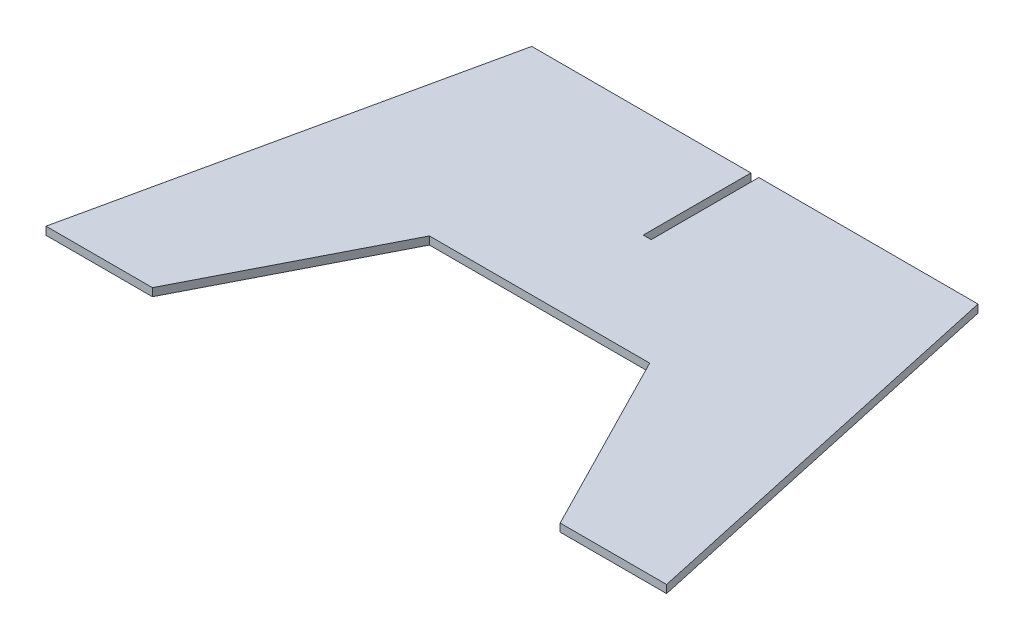
ISO-10303-21;
HEADER;
FILE_DESCRIPTION(('STEP AP214'),'2;1');
FILE_NAME('part.step','',(''),(''),'','','');
FILE_SCHEMA(('AUTOMOTIVE_DESIGN { 1 0 10303 214 1 1 1 1 }'));
ENDSEC;
DATA;
#1=APPLICATION_CONTEXT('core data for automotive mechanical design processes');
#2=APPLICATION_PROTOCOL_DEFINITION('international standard','automotive_design',2000,#1);
#3=PRODUCT_CONTEXT('',#1,'mechanical');
#4=PRODUCT('Part','Part','',(#3));
#5=PRODUCT_RELATED_PRODUCT_CATEGORY('part','',(#4));
#6=PRODUCT_DEFINITION_FORMATION('','',#4);
#7=PRODUCT_DEFINITION_CONTEXT('part definition',#1,'design');
#8=PRODUCT_DEFINITION('design','',#6,#7);
#9=PRODUCT_DEFINITION_SHAPE('','',#8);
#10=(LENGTH_UNIT() NAMED_UNIT(*) SI_UNIT(.MILLI.,.METRE.));
#11=(NAMED_UNIT(*) PLANE_ANGLE_UNIT() SI_UNIT($,.RADIAN.));
#12=(NAMED_UNIT(*) SI_UNIT($,.STERADIAN.) SOLID_ANGLE_UNIT());
#13=UNCERTAINTY_MEASURE_WITH_UNIT(LENGTH_MEASURE(1.E-05),#10,'distance_accuracy_value','');
#14=(GEOMETRIC_REPRESENTATION_CONTEXT(3) GLOBAL_UNCERTAINTY_ASSIGNED_CONTEXT((#13)) GLOBAL_UNIT_ASSIGNED_CONTEXT((#10,
#11,#12)) REPRESENTATION_CONTEXT('',''));
#15=CARTESIAN_POINT('',(0.,0.,0.));
#16=DIRECTION('',(0.,0.,1.));
#17=DIRECTION('',(1.,0.,0.));
#18=AXIS2_PLACEMENT_3D('',#15,#16,#17);
#19=CARTESIAN_POINT('',(0.,0.8636,-43.5));
#20=DIRECTION('',(0.,0.,1.));
#21=DIRECTION('',(1.,0.,0.));
#22=AXIS2_PLACEMENT_3D('',#19,#20,#21);
#23=PLANE('',#22);
#24=DIRECTION('',(-1.,0.,0.));
#25=VECTOR('',#24,1.);
#26=CARTESIAN_POINT('',(0.,0.,-43.5));
#27=LINE('',#26,#25);
#28=CARTESIAN_POINT('',(24.35,0.,-43.5));
#29=VERTEX_POINT('',#28);
#30=CARTESIAN_POINT('',(0.431799999999997,0.,-43.5));
#31=VERTEX_POINT('',#30);
#32=EDGE_CURVE('E170',#29,#31,#27,.T.);
#33=ORIENTED_EDGE('',*,*,#32,.T.);
#34=DIRECTION('',(0.,-1.,0.));
#35=VECTOR('',#34,1.);
#36=CARTESIAN_POINT('',(0.431799999999997,0.8636,-43.5));
#37=LINE('',#36,#35);
#38=CARTESIAN_POINT('',(0.431799999999997,0.8636,-43.5));
#39=VERTEX_POINT('',#38);
#40=EDGE_CURVE('E11',#39,#31,#37,.T.);
#41=ORIENTED_EDGE('',*,*,#40,.F.);
#42=DIRECTION('',(-1.,0.,0.));
#43=VECTOR('',#42,1.);
#44=CARTESIAN_POINT('',(0.,0.8636,-43.5));
#45=LINE('',#44,#43);
#46=CARTESIAN_POINT('',(24.35,0.8636,-43.5));
#47=VERTEX_POINT('',#46);
#48=EDGE_CURVE('E205',#47,#39,#45,.T.);
#49=ORIENTED_EDGE('',*,*,#48,.F.);
#50=DIRECTION('',(0.,-1.,0.));
#51=VECTOR('',#50,1.);
#52=CARTESIAN_POINT('',(24.35,0.8636,-43.5));
#53=LINE('',#52,#51);
#54=EDGE_CURVE('E166',#47,#29,#53,.T.);
#55=ORIENTED_EDGE('',*,*,#54,.T.);
#56=EDGE_LOOP('',(#33,#41,#49,#55));
#57=FACE_BOUND('',#56,.T.);
#58=ADVANCED_FACE('F44',(#57),#23,.F.);
#59=CARTESIAN_POINT('',(0.431800000000021,0.8636,0.));
#60=DIRECTION('',(1.,0.,0.));
#61=DIRECTION('',(0.,0.,-1.));
#62=AXIS2_PLACEMENT_3D('',#59,#60,#61);
#63=PLANE('',#62);
#64=DIRECTION('',(0.,0.,1.));
#65=VECTOR('',#64,1.);
#66=CARTESIAN_POINT('',(0.431800000000021,0.,0.));
#67=LINE('',#66,#65);
#68=CARTESIAN_POINT('',(0.431800000000003,0.,-31.75));
#69=VERTEX_POINT('',#68);
#70=EDGE_CURVE('E174',#31,#69,#67,.T.);
#71=ORIENTED_EDGE('',*,*,#70,.T.);
#72=DIRECTION('',(0.,-1.,0.));
#73=VECTOR('',#72,1.);
#74=CARTESIAN_POINT('',(0.431800000000003,0.8636,-31.75));
#75=LINE('',#74,#73);
#76=CARTESIAN_POINT('',(0.431800000000003,0.8636,-31.75));
#77=VERTEX_POINT('',#76);
#78=EDGE_CURVE('E54',#77,#69,#75,.T.);
#79=ORIENTED_EDGE('',*,*,#78,.F.);
#80=DIRECTION('',(0.,0.,1.));
#81=VECTOR('',#80,1.);
#82=CARTESIAN_POINT('',(0.431800000000021,0.8636,0.));
#83=LINE('',#82,#81);
#84=EDGE_CURVE('E117',#39,#77,#83,.T.);
#85=ORIENTED_EDGE('',*,*,#84,.F.);
#86=ORIENTED_EDGE('',*,*,#40,.T.);
#87=EDGE_LOOP('',(#71,#79,#85,#86));
#88=FACE_BOUND('',#87,.T.);
#89=ADVANCED_FACE('F46',(#88),#63,.F.);
#90=CARTESIAN_POINT('',(0.,0.8636,-31.75));
#91=DIRECTION('',(0.,0.,-1.));
#92=DIRECTION('',(-1.,0.,0.));
#93=AXIS2_PLACEMENT_3D('',#90,#91,#92);
#94=PLANE('',#93);
#95=DIRECTION('',(1.,0.,0.));
#96=VECTOR('',#95,1.);
#97=CARTESIAN_POINT('',(0.,0.,-31.75));
#98=LINE('',#97,#96);
#99=CARTESIAN_POINT('',(-0.431799999999997,0.,-31.75));
#100=VERTEX_POINT('',#99);
#101=EDGE_CURVE('E179',#100,#69,#98,.T.);
#102=ORIENTED_EDGE('',*,*,#101,.F.);
#103=DIRECTION('',(0.,-1.,0.));
#104=VECTOR('',#103,1.);
#105=CARTESIAN_POINT('',(-0.431799999999997,0.8636,-31.75));
#106=LINE('',#105,#104);
#107=CARTESIAN_POINT('',(-0.431799999999997,0.8636,-31.75));
#108=VERTEX_POINT('',#107);
#109=EDGE_CURVE('E231',#108,#100,#106,.T.);
#110=ORIENTED_EDGE('',*,*,#109,.F.);
#111=DIRECTION('',(1.,0.,0.));
#112=VECTOR('',#111,1.);
#113=CARTESIAN_POINT('',(0.,0.8636,-31.75));
#114=LINE('',#113,#112);
#115=EDGE_CURVE('E239',#108,#77,#114,.T.);
#116=ORIENTED_EDGE('',*,*,#115,.T.);
#117=ORIENTED_EDGE('',*,*,#78,.T.);
#118=EDGE_LOOP('',(#102,#110,#116,#117));
#119=FACE_BOUND('',#118,.T.);
#120=ADVANCED_FACE('F237',(#119),#94,.T.);
#121=CARTESIAN_POINT('',(-0.431799999999981,0.8636,0.));
#122=DIRECTION('',(1.,0.,0.));
#123=DIRECTION('',(0.,0.,-1.));
#124=AXIS2_PLACEMENT_3D('',#121,#122,#123);
#125=PLANE('',#124);
#126=DIRECTION('',(0.,0.,1.));
#127=VECTOR('',#126,1.);
#128=CARTESIAN_POINT('',(-0.431799999999981,0.,0.));
#129=LINE('',#128,#127);
#130=CARTESIAN_POINT('',(-0.431800000000003,0.,-43.5));
#131=VERTEX_POINT('',#130);
#132=EDGE_CURVE('E183',#131,#100,#129,.T.);
#133=ORIENTED_EDGE('',*,*,#132,.F.);
#134=DIRECTION('',(0.,-1.,0.));
#135=VECTOR('',#134,1.);
#136=CARTESIAN_POINT('',(-0.431800000000003,0.8636,-43.5));
#137=LINE('',#136,#135);
#138=CARTESIAN_POINT('',(-0.431800000000003,0.8636,-43.5));
#139=VERTEX_POINT('',#138);
#140=EDGE_CURVE('E228',#139,#131,#137,.T.);
#141=ORIENTED_EDGE('',*,*,#140,.F.);
#142=DIRECTION('',(0.,0.,1.));
#143=VECTOR('',#142,1.);
#144=CARTESIAN_POINT('',(-0.431799999999981,0.8636,0.));
#145=LINE('',#144,#143);
#146=EDGE_CURVE('E252',#139,#108,#145,.T.);
#147=ORIENTED_EDGE('',*,*,#146,.T.);
#148=ORIENTED_EDGE('',*,*,#109,.T.);
#149=EDGE_LOOP('',(#133,#141,#147,#148));
#150=FACE_BOUND('',#149,.T.);
#151=ADVANCED_FACE('F248',(#150),#125,.T.);
#152=CARTESIAN_POINT('',(-24.35,0.,-43.5));
#153=VERTEX_POINT('',#152);
#154=EDGE_CURVE('E175',#131,#153,#27,.T.);
#155=ORIENTED_EDGE('',*,*,#154,.T.);
#156=DIRECTION('',(0.,-1.,0.));
#157=VECTOR('',#156,1.);
#158=CARTESIAN_POINT('',(-24.35,0.8636,-43.5));
#159=LINE('',#158,#157);
#160=CARTESIAN_POINT('',(-24.35,0.8636,-43.5));
#161=VERTEX_POINT('',#160);
#162=EDGE_CURVE('E224',#161,#153,#159,.T.);
#163=ORIENTED_EDGE('',*,*,#162,.F.);
#164=EDGE_CURVE('E257',#139,#161,#45,.T.);
#165=ORIENTED_EDGE('',*,*,#164,.F.);
#166=ORIENTED_EDGE('',*,*,#140,.T.);
#167=EDGE_LOOP('',(#155,#163,#165,#166));
#168=FACE_BOUND('',#167,.T.);
#169=ADVANCED_FACE('F294',(#168),#23,.F.);
#170=CARTESIAN_POINT('',(-32.3178008588941,0.8636,-7.06801448853275));
#171=DIRECTION('',(0.976909510195615,0.,0.213653478533264));
#172=DIRECTION('',(0.213653478533264,0.,-0.976909510195615));
#173=AXIS2_PLACEMENT_3D('',#170,#171,#172);
#174=PLANE('',#173);
#175=DIRECTION('',(-0.213653478533264,0.,0.976909510195615));
#176=VECTOR('',#175,1.);
#177=CARTESIAN_POINT('',(-32.3178008588941,0.,-7.06801448853275));
#178=LINE('',#177,#176);
#179=CARTESIAN_POINT('',(-33.8636,0.,0.));
#180=VERTEX_POINT('',#179);
#181=EDGE_CURVE('E187',#153,#180,#178,.T.);
#182=ORIENTED_EDGE('',*,*,#181,.T.);
#183=DIRECTION('',(0.,-1.,0.));
#184=VECTOR('',#183,1.);
#185=CARTESIAN_POINT('',(-33.8636,0.8636,0.));
#186=LINE('',#185,#184);
#187=CARTESIAN_POINT('',(-33.8636,0.8636,0.));
#188=VERTEX_POINT('',#187);
#189=EDGE_CURVE('E220',#188,#180,#186,.T.);
#190=ORIENTED_EDGE('',*,*,#189,.F.);
#191=DIRECTION('',(-0.213653478533264,0.,0.976909510195615));
#192=VECTOR('',#191,1.);
#193=CARTESIAN_POINT('',(-32.3178008588941,0.8636,-7.06801448853275));
#194=LINE('',#193,#192);
#195=EDGE_CURVE('E262',#161,#188,#194,.T.);
#196=ORIENTED_EDGE('',*,*,#195,.F.);
#197=ORIENTED_EDGE('',*,*,#162,.T.);
#198=EDGE_LOOP('',(#182,#190,#196,#197));
#199=FACE_BOUND('',#198,.T.);
#200=ADVANCED_FACE('F291',(#199),#174,.F.);
#201=CARTESIAN_POINT('',(0.,0.8636,0.));
#202=DIRECTION('',(0.,0.,-1.));
#203=DIRECTION('',(-1.,0.,0.));
#204=AXIS2_PLACEMENT_3D('',#201,#202,#203);
#205=PLANE('',#204);
#206=DIRECTION('',(1.,0.,0.));
#207=VECTOR('',#206,1.);
#208=CARTESIAN_POINT('',(0.,0.,0.));
#209=LINE('',#208,#207);
#210=CARTESIAN_POINT('',(-22.25,0.,0.));
#211=VERTEX_POINT('',#210);
#212=EDGE_CURVE('E190',#180,#211,#209,.T.);
#213=ORIENTED_EDGE('',*,*,#212,.T.);
#214=DIRECTION('',(0.,-1.,0.));
#215=VECTOR('',#214,1.);
#216=CARTESIAN_POINT('',(-22.25,0.8636,0.));
#217=LINE('',#216,#215);
#218=CARTESIAN_POINT('',(-22.25,0.8636,0.));
#219=VERTEX_POINT('',#218);
#220=EDGE_CURVE('E216',#219,#211,#217,.T.);
#221=ORIENTED_EDGE('',*,*,#220,.F.);
#222=DIRECTION('',(1.,0.,0.));
#223=VECTOR('',#222,1.);
#224=CARTESIAN_POINT('',(0.,0.8636,0.));
#225=LINE('',#224,#223);
#226=EDGE_CURVE('E265',#188,#219,#225,.T.);
#227=ORIENTED_EDGE('',*,*,#226,.F.);
#228=ORIENTED_EDGE('',*,*,#189,.T.);
#229=EDGE_LOOP('',(#213,#221,#227,#228));
#230=FACE_BOUND('',#229,.T.);
#231=ADVANCED_FACE('F288',(#230),#205,.F.);
#232=CARTESIAN_POINT('',(-17.6359661753541,0.8636,-9.02069534256617));
#233=DIRECTION('',(-0.890296407537591,0.,-0.455381495809458));
#234=DIRECTION('',(-0.455381495809458,0.,0.890296407537591));
#235=AXIS2_PLACEMENT_3D('',#232,#233,#234);
#236=PLANE('',#235);
#237=DIRECTION('',(0.455381495809458,0.,-0.890296407537591));
#238=VECTOR('',#237,1.);
#239=CARTESIAN_POINT('',(-17.6359661753541,0.,-9.02069534256617));
#240=LINE('',#239,#238);
#241=CARTESIAN_POINT('',(-12.0201149425287,0.,-20.));
#242=VERTEX_POINT('',#241);
#243=EDGE_CURVE('E193',#211,#242,#240,.T.);
#244=ORIENTED_EDGE('',*,*,#243,.T.);
#245=DIRECTION('',(0.,-1.,0.));
#246=VECTOR('',#245,1.);
#247=CARTESIAN_POINT('',(-12.0201149425287,0.8636,-20.));
#248=LINE('',#247,#246);
#249=CARTESIAN_POINT('',(-12.0201149425287,0.8636,-20.));
#250=VERTEX_POINT('',#249);
#251=EDGE_CURVE('E212',#250,#242,#248,.T.);
#252=ORIENTED_EDGE('',*,*,#251,.F.);
#253=DIRECTION('',(0.455381495809458,0.,-0.890296407537591));
#254=VECTOR('',#253,1.);
#255=CARTESIAN_POINT('',(-17.6359661753541,0.8636,-9.02069534256617));
#256=LINE('',#255,#254);
#257=EDGE_CURVE('E268',#219,#250,#256,.T.);
#258=ORIENTED_EDGE('',*,*,#257,.F.);
#259=ORIENTED_EDGE('',*,*,#220,.T.);
#260=EDGE_LOOP('',(#244,#252,#258,#259));
#261=FACE_BOUND('',#260,.T.);
#262=ADVANCED_FACE('F284',(#261),#236,.F.);
#263=CARTESIAN_POINT('',(0.,0.8636,-20.));
#264=DIRECTION('',(0.,0.,-1.));
#265=DIRECTION('',(-1.,0.,0.));
#266=AXIS2_PLACEMENT_3D('',#263,#264,#265);
#267=PLANE('',#266);
#268=DIRECTION('',(1.,0.,0.));
#269=VECTOR('',#268,1.);
#270=CARTESIAN_POINT('',(0.,0.,-20.));
#271=LINE('',#270,#269);
#272=CARTESIAN_POINT('',(12.0201149425287,0.,-20.));
#273=VERTEX_POINT('',#272);
#274=EDGE_CURVE('E196',#242,#273,#271,.T.);
#275=ORIENTED_EDGE('',*,*,#274,.T.);
#276=DIRECTION('',(0.,-1.,0.));
#277=VECTOR('',#276,1.);
#278=CARTESIAN_POINT('',(12.0201149425287,0.8636,-20.));
#279=LINE('',#278,#277);
#280=CARTESIAN_POINT('',(12.0201149425287,0.8636,-20.));
#281=VERTEX_POINT('',#280);
#282=EDGE_CURVE('E159',#281,#273,#279,.T.);
#283=ORIENTED_EDGE('',*,*,#282,.F.);
#284=DIRECTION('',(1.,0.,0.));
#285=VECTOR('',#284,1.);
#286=CARTESIAN_POINT('',(0.,0.8636,-20.));
#287=LINE('',#286,#285);
#288=EDGE_CURVE('E148',#250,#281,#287,.T.);
#289=ORIENTED_EDGE('',*,*,#288,.F.);
#290=ORIENTED_EDGE('',*,*,#251,.T.);
#291=EDGE_LOOP('',(#275,#283,#289,#290));
#292=FACE_BOUND('',#291,.T.);
#293=ADVANCED_FACE('F280',(#292),#267,.F.);
#294=CARTESIAN_POINT('',(17.6359661753541,0.8636,-9.02069534256618));
#295=DIRECTION('',(0.890296407537591,0.,-0.455381495809458));
#296=DIRECTION('',(-0.455381495809458,0.,-0.890296407537591));
#297=AXIS2_PLACEMENT_3D('',#294,#295,#296);
#298=PLANE('',#297);
#299=DIRECTION('',(0.455381495809458,0.,0.890296407537591));
#300=VECTOR('',#299,1.);
#301=CARTESIAN_POINT('',(17.6359661753541,0.,-9.02069534256618));
#302=LINE('',#301,#300);
#303=CARTESIAN_POINT('',(22.25,0.,0.));
#304=VERTEX_POINT('',#303);
#305=EDGE_CURVE('E157',#273,#304,#302,.T.);
#306=ORIENTED_EDGE('',*,*,#305,.T.);
#307=DIRECTION('',(0.,-1.,0.));
#308=VECTOR('',#307,1.);
#309=CARTESIAN_POINT('',(22.25,0.8636,0.));
#310=LINE('',#309,#308);
#311=CARTESIAN_POINT('',(22.25,0.8636,0.));
#312=VERTEX_POINT('',#311);
#313=EDGE_CURVE('E154',#312,#304,#310,.T.);
#314=ORIENTED_EDGE('',*,*,#313,.F.);
#315=DIRECTION('',(0.455381495809458,0.,0.890296407537591));
#316=VECTOR('',#315,1.);
#317=CARTESIAN_POINT('',(17.6359661753541,0.8636,-9.02069534256618));
#318=LINE('',#317,#316);
#319=EDGE_CURVE('E142',#281,#312,#318,.T.);
#320=ORIENTED_EDGE('',*,*,#319,.F.);
#321=ORIENTED_EDGE('',*,*,#282,.T.);
#322=EDGE_LOOP('',(#306,#314,#320,#321));
#323=FACE_BOUND('',#322,.T.);
#324=ADVANCED_FACE('F155',(#323),#298,.F.);
#325=CARTESIAN_POINT('',(0.,0.8636,0.));
#326=DIRECTION('',(0.,0.,-1.));
#327=DIRECTION('',(-1.,0.,0.));
#328=AXIS2_PLACEMENT_3D('',#325,#326,#327);
#329=PLANE('',#328);
#330=DIRECTION('',(1.,0.,0.));
#331=VECTOR('',#330,1.);
#332=CARTESIAN_POINT('',(0.,0.,0.));
#333=LINE('',#332,#331);
#334=CARTESIAN_POINT('',(33.8636,0.,0.));
#335=VERTEX_POINT('',#334);
#336=EDGE_CURVE('E103',#304,#335,#333,.T.);
#337=ORIENTED_EDGE('',*,*,#336,.T.);
#338=DIRECTION('',(0.,-1.,0.));
#339=VECTOR('',#338,1.);
#340=CARTESIAN_POINT('',(33.8636,0.8636,0.));
#341=LINE('',#340,#339);
#342=CARTESIAN_POINT('',(33.8636,0.8636,0.));
#343=VERTEX_POINT('',#342);
#344=EDGE_CURVE('E160',#343,#335,#341,.T.);
#345=ORIENTED_EDGE('',*,*,#344,.F.);
#346=DIRECTION('',(1.,0.,0.));
#347=VECTOR('',#346,1.);
#348=CARTESIAN_POINT('',(0.,0.8636,0.));
#349=LINE('',#348,#347);
#350=EDGE_CURVE('E146',#312,#343,#349,.T.);
#351=ORIENTED_EDGE('',*,*,#350,.F.);
#352=ORIENTED_EDGE('',*,*,#313,.T.);
#353=EDGE_LOOP('',(#337,#345,#351,#352));
#354=FACE_BOUND('',#353,.T.);
#355=ADVANCED_FACE('F162',(#354),#329,.F.);
#356=CARTESIAN_POINT('',(32.3178008588941,0.8636,-7.06801448853278));
#357=DIRECTION('',(-0.976909510195615,0.,0.213653478533265));
#358=DIRECTION('',(0.213653478533265,0.,0.976909510195615));
#359=AXIS2_PLACEMENT_3D('',#356,#357,#358);
#360=PLANE('',#359);
#361=DIRECTION('',(-0.213653478533265,0.,-0.976909510195615));
#362=VECTOR('',#361,1.);
#363=CARTESIAN_POINT('',(32.3178008588941,0.,-7.06801448853278));
#364=LINE('',#363,#362);
#365=EDGE_CURVE('E109',#335,#29,#364,.T.);
#366=ORIENTED_EDGE('',*,*,#365,.T.);
#367=ORIENTED_EDGE('',*,*,#54,.F.);
#368=DIRECTION('',(-0.213653478533265,0.,-0.976909510195615));
#369=VECTOR('',#368,1.);
#370=CARTESIAN_POINT('',(32.3178008588941,0.8636,-7.06801448853278));
#371=LINE('',#370,#369);
#372=EDGE_CURVE('E62',#343,#47,#371,.T.);
#373=ORIENTED_EDGE('',*,*,#372,.F.);
#374=ORIENTED_EDGE('',*,*,#344,.T.);
#375=EDGE_LOOP('',(#366,#367,#373,#374));
#376=FACE_BOUND('',#375,.T.);
#377=ADVANCED_FACE('F375',(#376),#360,.F.);
#378=CARTESIAN_POINT('',(0.,0.8636,0.));
#379=DIRECTION('',(0.,1.,0.));
#380=DIRECTION('',(0.,0.,1.));
#381=AXIS2_PLACEMENT_3D('',#378,#379,#380);
#382=PLANE('',#381);
#383=ORIENTED_EDGE('',*,*,#48,.T.);
#384=ORIENTED_EDGE('',*,*,#84,.T.);
#385=ORIENTED_EDGE('',*,*,#115,.F.);
#386=ORIENTED_EDGE('',*,*,#146,.F.);
#387=ORIENTED_EDGE('',*,*,#164,.T.);
#388=ORIENTED_EDGE('',*,*,#195,.T.);
#389=ORIENTED_EDGE('',*,*,#226,.T.);
#390=ORIENTED_EDGE('',*,*,#257,.T.);
#391=ORIENTED_EDGE('',*,*,#288,.T.);
#392=ORIENTED_EDGE('',*,*,#319,.T.);
#393=ORIENTED_EDGE('',*,*,#350,.T.);
#394=ORIENTED_EDGE('',*,*,#372,.T.);
#395=EDGE_LOOP('',(#383,#384,#385,#386,#387,#388,#389,#390,#391,#392,#393,#394));
#396=FACE_BOUND('',#395,.T.);
#397=ADVANCED_FACE('F144',(#396),#382,.T.);
#398=CARTESIAN_POINT('',(0.,0.,0.));
#399=DIRECTION('',(0.,1.,0.));
#400=DIRECTION('',(0.,0.,1.));
#401=AXIS2_PLACEMENT_3D('',#398,#399,#400);
#402=PLANE('',#401);
#403=ORIENTED_EDGE('',*,*,#32,.F.);
#404=ORIENTED_EDGE('',*,*,#365,.F.);
#405=ORIENTED_EDGE('',*,*,#336,.F.);
#406=ORIENTED_EDGE('',*,*,#305,.F.);
#407=ORIENTED_EDGE('',*,*,#274,.F.);
#408=ORIENTED_EDGE('',*,*,#243,.F.);
#409=ORIENTED_EDGE('',*,*,#212,.F.);
#410=ORIENTED_EDGE('',*,*,#181,.F.);
#411=ORIENTED_EDGE('',*,*,#154,.F.);
#412=ORIENTED_EDGE('',*,*,#132,.T.);
#413=ORIENTED_EDGE('',*,*,#101,.T.);
#414=ORIENTED_EDGE('',*,*,#70,.F.);
#415=EDGE_LOOP('',(#403,#404,#405,#406,#407,#408,#409,#410,#411,#412,#413,#414));
#416=FACE_BOUND('',#415,.T.);
#417=ADVANCED_FACE('F243',(#416),#402,.F.);
#418=CLOSED_SHELL('',(#58,#89,#120,#151,#169,#200,#231,#262,#293,#324,#355,#377,#397,#417));
#419=MANIFOLD_SOLID_BREP('B2',#418);
#420=ADVANCED_BREP_SHAPE_REPRESENTATION('',(#18,#419),#14);
#421=SHAPE_DEFINITION_REPRESENTATION(#9,#420);
ENDSEC;
END-ISO-10303-21;
